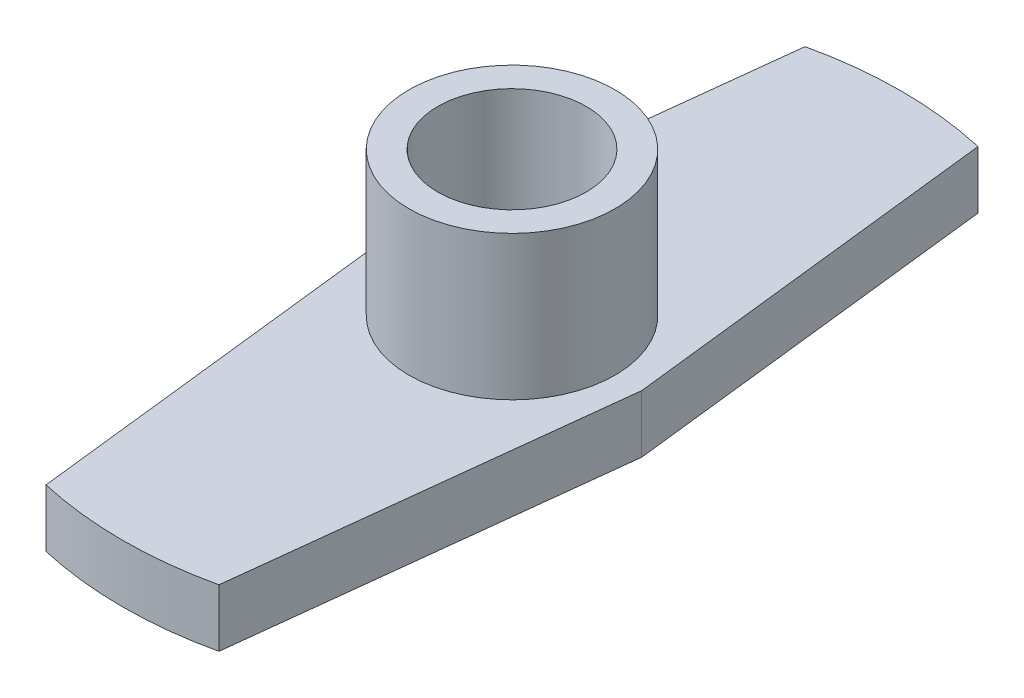
ISO-10303-21;
HEADER;
FILE_DESCRIPTION(('STEP AP214'),'2;1');
FILE_NAME('part.step','',(''),(''),'','','');
FILE_SCHEMA(('AUTOMOTIVE_DESIGN { 1 0 10303 214 1 1 1 1 }'));
ENDSEC;
DATA;
#1=APPLICATION_CONTEXT('core data for automotive mechanical design processes');
#2=APPLICATION_PROTOCOL_DEFINITION('international standard','automotive_design',2000,#1);
#3=PRODUCT_CONTEXT('',#1,'mechanical');
#4=PRODUCT('Part','Part','',(#3));
#5=PRODUCT_RELATED_PRODUCT_CATEGORY('part','',(#4));
#6=PRODUCT_DEFINITION_FORMATION('','',#4);
#7=PRODUCT_DEFINITION_CONTEXT('part definition',#1,'design');
#8=PRODUCT_DEFINITION('design','',#6,#7);
#9=PRODUCT_DEFINITION_SHAPE('','',#8);
#10=(LENGTH_UNIT() NAMED_UNIT(*) SI_UNIT(.MILLI.,.METRE.));
#11=(NAMED_UNIT(*) PLANE_ANGLE_UNIT() SI_UNIT($,.RADIAN.));
#12=(NAMED_UNIT(*) SI_UNIT($,.STERADIAN.) SOLID_ANGLE_UNIT());
#13=UNCERTAINTY_MEASURE_WITH_UNIT(LENGTH_MEASURE(1.E-05),#10,'distance_accuracy_value','');
#14=(GEOMETRIC_REPRESENTATION_CONTEXT(3) GLOBAL_UNCERTAINTY_ASSIGNED_CONTEXT((#13)) GLOBAL_UNIT_ASSIGNED_CONTEXT((#10,
#11,#12)) REPRESENTATION_CONTEXT('',''));
#15=CARTESIAN_POINT('',(0.,0.,0.));
#16=DIRECTION('',(0.,0.,1.));
#17=DIRECTION('',(1.,0.,0.));
#18=AXIS2_PLACEMENT_3D('',#15,#16,#17);
#19=CARTESIAN_POINT('',(0.,2.,0.));
#20=DIRECTION('',(0.,-1.,0.));
#21=DIRECTION('',(0.,0.,-1.));
#22=AXIS2_PLACEMENT_3D('',#19,#20,#21);
#23=CYLINDRICAL_SURFACE('',#22,13.5);
#24=CARTESIAN_POINT('',(0.,0.,0.));
#25=DIRECTION('',(0.,1.,0.));
#26=DIRECTION('',(0.,0.,1.));
#27=AXIS2_PLACEMENT_3D('',#24,#25,#26);
#28=CIRCLE('',#27,13.5);
#29=CARTESIAN_POINT('',(3.,0.,-13.1624465810882));
#30=VERTEX_POINT('',#29);
#31=CARTESIAN_POINT('',(-3.,0.,-13.1624465810882));
#32=VERTEX_POINT('',#31);
#33=EDGE_CURVE('E118',#30,#32,#28,.T.);
#34=ORIENTED_EDGE('',*,*,#33,.T.);
#35=DIRECTION('',(0.,-1.,0.));
#36=VECTOR('',#35,1.);
#37=CARTESIAN_POINT('',(-3.,2.,-13.1624465810882));
#38=LINE('',#37,#36);
#39=CARTESIAN_POINT('',(-3.,2.,-13.1624465810882));
#40=VERTEX_POINT('',#39);
#41=EDGE_CURVE('E41',#40,#32,#38,.T.);
#42=ORIENTED_EDGE('',*,*,#41,.F.);
#43=CARTESIAN_POINT('',(0.,2.,0.));
#44=DIRECTION('',(0.,1.,0.));
#45=DIRECTION('',(0.,0.,1.));
#46=AXIS2_PLACEMENT_3D('',#43,#44,#45);
#47=CIRCLE('',#46,13.5);
#48=CARTESIAN_POINT('',(3.,2.,-13.1624465810882));
#49=VERTEX_POINT('',#48);
#50=EDGE_CURVE('E129',#49,#40,#47,.T.);
#51=ORIENTED_EDGE('',*,*,#50,.F.);
#52=DIRECTION('',(0.,-1.,0.));
#53=VECTOR('',#52,1.);
#54=CARTESIAN_POINT('',(3.,2.,-13.1624465810882));
#55=LINE('',#54,#53);
#56=EDGE_CURVE('E114',#49,#30,#55,.T.);
#57=ORIENTED_EDGE('',*,*,#56,.T.);
#58=EDGE_LOOP('',(#34,#42,#51,#57));
#59=FACE_BOUND('',#58,.T.);
#60=ADVANCED_FACE('F33',(#59),#23,.T.);
#61=CARTESIAN_POINT('',(-3.,2.,-13.1624465810882));
#62=DIRECTION('',(0.99356906512808,0.,0.11322770341446));
#63=DIRECTION('',(0.11322770341446,0.,-0.99356906512808));
#64=AXIS2_PLACEMENT_3D('',#61,#62,#63);
#65=PLANE('',#64);
#66=DIRECTION('',(-0.11322770341446,0.,0.99356906512808));
#67=VECTOR('',#66,1.);
#68=CARTESIAN_POINT('',(-3.,0.,-13.1624465810882));
#69=LINE('',#68,#67);
#70=CARTESIAN_POINT('',(-4.5,0.,0.));
#71=VERTEX_POINT('',#70);
#72=EDGE_CURVE('E121',#32,#71,#69,.T.);
#73=ORIENTED_EDGE('',*,*,#72,.T.);
#74=DIRECTION('',(0.,-1.,0.));
#75=VECTOR('',#74,1.);
#76=CARTESIAN_POINT('',(-4.5,2.,0.));
#77=LINE('',#76,#75);
#78=CARTESIAN_POINT('',(-4.5,2.,0.));
#79=VERTEX_POINT('',#78);
#80=EDGE_CURVE('E133',#79,#71,#77,.T.);
#81=ORIENTED_EDGE('',*,*,#80,.F.);
#82=DIRECTION('',(-0.11322770341446,0.,0.99356906512808));
#83=VECTOR('',#82,1.);
#84=CARTESIAN_POINT('',(-3.,2.,-13.1624465810882));
#85=LINE('',#84,#83);
#86=EDGE_CURVE('E87',#40,#79,#85,.T.);
#87=ORIENTED_EDGE('',*,*,#86,.F.);
#88=ORIENTED_EDGE('',*,*,#41,.T.);
#89=EDGE_LOOP('',(#73,#81,#87,#88));
#90=FACE_BOUND('',#89,.T.);
#91=ADVANCED_FACE('F136',(#90),#65,.F.);
#92=CARTESIAN_POINT('',(-4.5,2.,0.));
#93=DIRECTION('',(0.99356906512808,0.,-0.11322770341446));
#94=DIRECTION('',(-0.11322770341446,0.,-0.99356906512808));
#95=AXIS2_PLACEMENT_3D('',#92,#93,#94);
#96=PLANE('',#95);
#97=DIRECTION('',(0.11322770341446,0.,0.99356906512808));
#98=VECTOR('',#97,1.);
#99=CARTESIAN_POINT('',(-4.5,0.,0.));
#100=LINE('',#99,#98);
#101=CARTESIAN_POINT('',(-3.,0.,13.1624465810882));
#102=VERTEX_POINT('',#101);
#103=EDGE_CURVE('E124',#71,#102,#100,.T.);
#104=ORIENTED_EDGE('',*,*,#103,.T.);
#105=DIRECTION('',(0.,-1.,0.));
#106=VECTOR('',#105,1.);
#107=CARTESIAN_POINT('',(-3.,2.,13.1624465810882));
#108=LINE('',#107,#106);
#109=CARTESIAN_POINT('',(-3.,2.,13.1624465810882));
#110=VERTEX_POINT('',#109);
#111=EDGE_CURVE('E109',#110,#102,#108,.T.);
#112=ORIENTED_EDGE('',*,*,#111,.F.);
#113=DIRECTION('',(0.11322770341446,0.,0.99356906512808));
#114=VECTOR('',#113,1.);
#115=CARTESIAN_POINT('',(-4.5,2.,0.));
#116=LINE('',#115,#114);
#117=EDGE_CURVE('E100',#79,#110,#116,.T.);
#118=ORIENTED_EDGE('',*,*,#117,.F.);
#119=ORIENTED_EDGE('',*,*,#80,.T.);
#120=EDGE_LOOP('',(#104,#112,#118,#119));
#121=FACE_BOUND('',#120,.T.);
#122=ADVANCED_FACE('F144',(#121),#96,.F.);
#123=CARTESIAN_POINT('',(0.,2.,0.));
#124=DIRECTION('',(0.,-1.,0.));
#125=DIRECTION('',(0.,0.,-1.));
#126=AXIS2_PLACEMENT_3D('',#123,#124,#125);
#127=CYLINDRICAL_SURFACE('',#126,13.5);
#128=CARTESIAN_POINT('',(0.,0.,0.));
#129=DIRECTION('',(0.,1.,0.));
#130=DIRECTION('',(0.,0.,1.));
#131=AXIS2_PLACEMENT_3D('',#128,#129,#130);
#132=CIRCLE('',#131,13.5);
#133=CARTESIAN_POINT('',(3.,0.,13.1624465810882));
#134=VERTEX_POINT('',#133);
#135=EDGE_CURVE('E108',#102,#134,#132,.T.);
#136=ORIENTED_EDGE('',*,*,#135,.T.);
#137=DIRECTION('',(0.,-1.,0.));
#138=VECTOR('',#137,1.);
#139=CARTESIAN_POINT('',(3.,2.,13.1624465810882));
#140=LINE('',#139,#138);
#141=CARTESIAN_POINT('',(3.,2.,13.1624465810882));
#142=VERTEX_POINT('',#141);
#143=EDGE_CURVE('E105',#142,#134,#140,.T.);
#144=ORIENTED_EDGE('',*,*,#143,.F.);
#145=CARTESIAN_POINT('',(0.,2.,0.));
#146=DIRECTION('',(0.,1.,0.));
#147=DIRECTION('',(0.,0.,1.));
#148=AXIS2_PLACEMENT_3D('',#145,#146,#147);
#149=CIRCLE('',#148,13.5);
#150=EDGE_CURVE('E94',#110,#142,#149,.T.);
#151=ORIENTED_EDGE('',*,*,#150,.F.);
#152=ORIENTED_EDGE('',*,*,#111,.T.);
#153=EDGE_LOOP('',(#136,#144,#151,#152));
#154=FACE_BOUND('',#153,.T.);
#155=ADVANCED_FACE('F106',(#154),#127,.T.);
#156=CARTESIAN_POINT('',(4.5,2.,0.));
#157=DIRECTION('',(-0.99356906512808,0.,-0.11322770341446));
#158=DIRECTION('',(-0.11322770341446,0.,0.99356906512808));
#159=AXIS2_PLACEMENT_3D('',#156,#157,#158);
#160=PLANE('',#159);
#161=DIRECTION('',(0.11322770341446,0.,-0.99356906512808));
#162=VECTOR('',#161,1.);
#163=CARTESIAN_POINT('',(4.5,0.,0.));
#164=LINE('',#163,#162);
#165=CARTESIAN_POINT('',(4.5,0.,0.));
#166=VERTEX_POINT('',#165);
#167=EDGE_CURVE('E72',#134,#166,#164,.T.);
#168=ORIENTED_EDGE('',*,*,#167,.T.);
#169=DIRECTION('',(0.,-1.,0.));
#170=VECTOR('',#169,1.);
#171=CARTESIAN_POINT('',(4.5,2.,0.));
#172=LINE('',#171,#170);
#173=CARTESIAN_POINT('',(4.5,2.,0.));
#174=VERTEX_POINT('',#173);
#175=EDGE_CURVE('E110',#174,#166,#172,.T.);
#176=ORIENTED_EDGE('',*,*,#175,.F.);
#177=DIRECTION('',(0.11322770341446,0.,-0.99356906512808));
#178=VECTOR('',#177,1.);
#179=CARTESIAN_POINT('',(4.5,2.,0.));
#180=LINE('',#179,#178);
#181=EDGE_CURVE('E98',#142,#174,#180,.T.);
#182=ORIENTED_EDGE('',*,*,#181,.F.);
#183=ORIENTED_EDGE('',*,*,#143,.T.);
#184=EDGE_LOOP('',(#168,#176,#182,#183));
#185=FACE_BOUND('',#184,.T.);
#186=ADVANCED_FACE('F112',(#185),#160,.F.);
#187=CARTESIAN_POINT('',(3.,2.,-13.1624465810882));
#188=DIRECTION('',(-0.99356906512808,0.,0.11322770341446));
#189=DIRECTION('',(0.11322770341446,0.,0.99356906512808));
#190=AXIS2_PLACEMENT_3D('',#187,#188,#189);
#191=PLANE('',#190);
#192=DIRECTION('',(-0.11322770341446,0.,-0.99356906512808));
#193=VECTOR('',#192,1.);
#194=CARTESIAN_POINT('',(3.,0.,-13.1624465810882));
#195=LINE('',#194,#193);
#196=EDGE_CURVE('E78',#166,#30,#195,.T.);
#197=ORIENTED_EDGE('',*,*,#196,.T.);
#198=ORIENTED_EDGE('',*,*,#56,.F.);
#199=DIRECTION('',(-0.11322770341446,0.,-0.99356906512808));
#200=VECTOR('',#199,1.);
#201=CARTESIAN_POINT('',(3.,2.,-13.1624465810882));
#202=LINE('',#201,#200);
#203=EDGE_CURVE('E49',#174,#49,#202,.T.);
#204=ORIENTED_EDGE('',*,*,#203,.F.);
#205=ORIENTED_EDGE('',*,*,#175,.T.);
#206=EDGE_LOOP('',(#197,#198,#204,#205));
#207=FACE_BOUND('',#206,.T.);
#208=ADVANCED_FACE('F187',(#207),#191,.F.);
#209=CARTESIAN_POINT('',(0.,2.,0.));
#210=DIRECTION('',(0.,1.,0.));
#211=DIRECTION('',(0.,0.,1.));
#212=AXIS2_PLACEMENT_3D('',#209,#210,#211);
#213=PLANE('',#212);
#214=CARTESIAN_POINT('',(0.,2.,0.));
#215=DIRECTION('',(0.,1.,0.));
#216=DIRECTION('',(0.,0.,1.));
#217=AXIS2_PLACEMENT_3D('',#214,#215,#216);
#218=CIRCLE('',#217,3.575);
#219=CARTESIAN_POINT('',(0.,2.,3.575));
#220=VERTEX_POINT('',#219);
#221=EDGE_CURVE('E148',#220,#220,#218,.T.);
#222=ORIENTED_EDGE('',*,*,#221,.F.);
#223=EDGE_LOOP('',(#222));
#224=FACE_BOUND('',#223,.T.);
#225=ORIENTED_EDGE('',*,*,#50,.T.);
#226=ORIENTED_EDGE('',*,*,#86,.T.);
#227=ORIENTED_EDGE('',*,*,#117,.T.);
#228=ORIENTED_EDGE('',*,*,#150,.T.);
#229=ORIENTED_EDGE('',*,*,#181,.T.);
#230=ORIENTED_EDGE('',*,*,#203,.T.);
#231=EDGE_LOOP('',(#225,#226,#227,#228,#229,#230));
#232=FACE_BOUND('',#231,.T.);
#233=ADVANCED_FACE('F96',(#224,#232),#213,.T.);
#234=CARTESIAN_POINT('',(0.,0.,0.));
#235=DIRECTION('',(0.,1.,0.));
#236=DIRECTION('',(0.,0.,1.));
#237=AXIS2_PLACEMENT_3D('',#234,#235,#236);
#238=PLANE('',#237);
#239=ORIENTED_EDGE('',*,*,#33,.F.);
#240=ORIENTED_EDGE('',*,*,#196,.F.);
#241=ORIENTED_EDGE('',*,*,#167,.F.);
#242=ORIENTED_EDGE('',*,*,#135,.F.);
#243=ORIENTED_EDGE('',*,*,#103,.F.);
#244=ORIENTED_EDGE('',*,*,#72,.F.);
#245=EDGE_LOOP('',(#239,#240,#241,#242,#243,#244));
#246=FACE_BOUND('',#245,.T.);
#247=ADVANCED_FACE('F141',(#246),#238,.F.);
#248=CARTESIAN_POINT('',(0.,7.,0.));
#249=DIRECTION('',(0.,1.,0.));
#250=DIRECTION('',(0.,0.,1.));
#251=AXIS2_PLACEMENT_3D('',#248,#249,#250);
#252=PLANE('',#251);
#253=CARTESIAN_POINT('',(0.,7.,0.));
#254=DIRECTION('',(0.,1.,0.));
#255=DIRECTION('',(0.,0.,1.));
#256=AXIS2_PLACEMENT_3D('',#253,#254,#255);
#257=CIRCLE('',#256,3.575);
#258=CARTESIAN_POINT('',(0.,7.,3.575));
#259=VERTEX_POINT('',#258);
#260=EDGE_CURVE('E122',#259,#259,#257,.T.);
#261=ORIENTED_EDGE('',*,*,#260,.T.);
#262=EDGE_LOOP('',(#261));
#263=FACE_BOUND('',#262,.T.);
#264=CARTESIAN_POINT('',(0.,7.,0.));
#265=DIRECTION('',(0.,1.,0.));
#266=DIRECTION('',(0.,0.,1.));
#267=AXIS2_PLACEMENT_3D('',#264,#265,#266);
#268=CIRCLE('',#267,2.575);
#269=CARTESIAN_POINT('',(0.,7.,2.575));
#270=VERTEX_POINT('',#269);
#271=EDGE_CURVE('E151',#270,#270,#268,.T.);
#272=ORIENTED_EDGE('',*,*,#271,.F.);
#273=EDGE_LOOP('',(#272));
#274=FACE_BOUND('',#273,.T.);
#275=ADVANCED_FACE('F160',(#263,#274),#252,.T.);
#276=CARTESIAN_POINT('',(0.,7.,0.));
#277=DIRECTION('',(0.,-1.,0.));
#278=DIRECTION('',(0.,0.,-1.));
#279=AXIS2_PLACEMENT_3D('',#276,#277,#278);
#280=CYLINDRICAL_SURFACE('',#279,3.575);
#281=ORIENTED_EDGE('',*,*,#260,.F.);
#282=EDGE_LOOP('',(#281));
#283=FACE_BOUND('',#282,.T.);
#284=ORIENTED_EDGE('',*,*,#221,.T.);
#285=EDGE_LOOP('',(#284));
#286=FACE_BOUND('',#285,.T.);
#287=ADVANCED_FACE('F162',(#283,#286),#280,.T.);
#288=CARTESIAN_POINT('',(0.,7.,0.));
#289=DIRECTION('',(0.,-1.,0.));
#290=DIRECTION('',(0.,0.,-1.));
#291=AXIS2_PLACEMENT_3D('',#288,#289,#290);
#292=CYLINDRICAL_SURFACE('',#291,2.575);
#293=ORIENTED_EDGE('',*,*,#271,.T.);
#294=EDGE_LOOP('',(#293));
#295=FACE_BOUND('',#294,.T.);
#296=CARTESIAN_POINT('',(0.,2.,0.));
#297=DIRECTION('',(0.,1.,0.));
#298=DIRECTION('',(0.,0.,1.));
#299=AXIS2_PLACEMENT_3D('',#296,#297,#298);
#300=CIRCLE('',#299,2.575);
#301=CARTESIAN_POINT('',(0.,2.,2.575));
#302=VERTEX_POINT('',#301);
#303=EDGE_CURVE('E11',#302,#302,#300,.F.);
#304=ORIENTED_EDGE('',*,*,#303,.T.);
#305=EDGE_LOOP('',(#304));
#306=FACE_BOUND('',#305,.T.);
#307=ADVANCED_FACE('F157',(#295,#306),#292,.F.);
#308=ORIENTED_EDGE('',*,*,#303,.F.);
#309=EDGE_LOOP('',(#308));
#310=FACE_BOUND('',#309,.T.);
#311=ADVANCED_FACE('F192',(#310),#213,.T.);
#312=CLOSED_SHELL('',(#60,#91,#122,#155,#186,#208,#233,#247,#275,#287,#307,#311));
#313=MANIFOLD_SOLID_BREP('B2',#312);
#314=ADVANCED_BREP_SHAPE_REPRESENTATION('',(#18,#313),#14);
#315=SHAPE_DEFINITION_REPRESENTATION(#9,#314);
ENDSEC;
END-ISO-10303-21;
